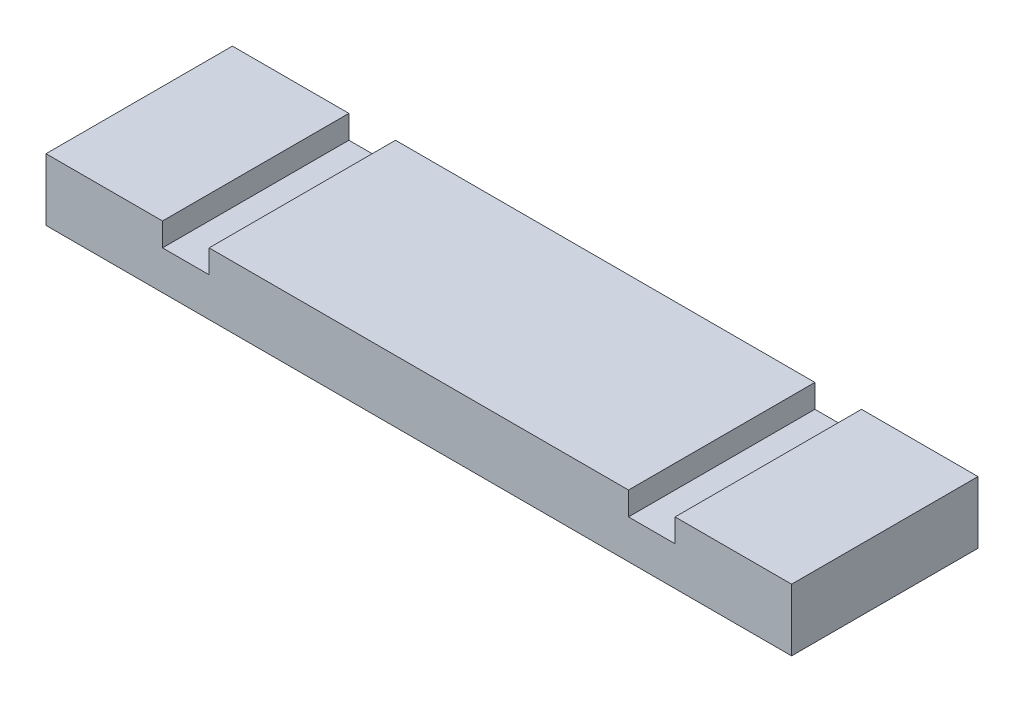
ISO-10303-21;
HEADER;
FILE_DESCRIPTION(('STEP AP214'),'2;1');
FILE_NAME('part.step','',(''),(''),'','','');
FILE_SCHEMA(('AUTOMOTIVE_DESIGN { 1 0 10303 214 1 1 1 1 }'));
ENDSEC;
DATA;
#1=APPLICATION_CONTEXT('core data for automotive mechanical design processes');
#2=APPLICATION_PROTOCOL_DEFINITION('international standard','automotive_design',2000,#1);
#3=PRODUCT_CONTEXT('',#1,'mechanical');
#4=PRODUCT('Part','Part','',(#3));
#5=PRODUCT_RELATED_PRODUCT_CATEGORY('part','',(#4));
#6=PRODUCT_DEFINITION_FORMATION('','',#4);
#7=PRODUCT_DEFINITION_CONTEXT('part definition',#1,'design');
#8=PRODUCT_DEFINITION('design','',#6,#7);
#9=PRODUCT_DEFINITION_SHAPE('','',#8);
#10=(LENGTH_UNIT() NAMED_UNIT(*) SI_UNIT(.MILLI.,.METRE.));
#11=(NAMED_UNIT(*) PLANE_ANGLE_UNIT() SI_UNIT($,.RADIAN.));
#12=(NAMED_UNIT(*) SI_UNIT($,.STERADIAN.) SOLID_ANGLE_UNIT());
#13=UNCERTAINTY_MEASURE_WITH_UNIT(LENGTH_MEASURE(1.E-05),#10,'distance_accuracy_value','');
#14=(GEOMETRIC_REPRESENTATION_CONTEXT(3) GLOBAL_UNCERTAINTY_ASSIGNED_CONTEXT((#13)) GLOBAL_UNIT_ASSIGNED_CONTEXT((#10,
#11,#12)) REPRESENTATION_CONTEXT('',''));
#15=CARTESIAN_POINT('',(0.,0.,0.));
#16=DIRECTION('',(0.,0.,1.));
#17=DIRECTION('',(1.,0.,0.));
#18=AXIS2_PLACEMENT_3D('',#15,#16,#17);
#19=CARTESIAN_POINT('',(0.,4.,0.));
#20=DIRECTION('',(0.,-1.,0.));
#21=DIRECTION('',(0.,0.,-1.));
#22=AXIS2_PLACEMENT_3D('',#19,#20,#21);
#23=PLANE('',#22);
#24=DIRECTION('',(0.,0.,1.));
#25=VECTOR('',#24,1.);
#26=CARTESIAN_POINT('',(-16.5,4.,-6.));
#27=LINE('',#26,#25);
#28=CARTESIAN_POINT('',(-16.5,4.,-6.));
#29=VERTEX_POINT('',#28);
#30=CARTESIAN_POINT('',(-16.5,4.,6.));
#31=VERTEX_POINT('',#30);
#32=EDGE_CURVE('E173',#29,#31,#27,.T.);
#33=ORIENTED_EDGE('',*,*,#32,.F.);
#34=DIRECTION('',(-1.,0.,0.));
#35=VECTOR('',#34,1.);
#36=CARTESIAN_POINT('',(-24.,4.,-6.));
#37=LINE('',#36,#35);
#38=CARTESIAN_POINT('',(-24.,4.,-6.));
#39=VERTEX_POINT('',#38);
#40=EDGE_CURVE('E185',#29,#39,#37,.T.);
#41=ORIENTED_EDGE('',*,*,#40,.T.);
#42=DIRECTION('',(0.,0.,1.));
#43=VECTOR('',#42,1.);
#44=CARTESIAN_POINT('',(-24.,4.,6.));
#45=LINE('',#44,#43);
#46=CARTESIAN_POINT('',(-24.,4.,6.));
#47=VERTEX_POINT('',#46);
#48=EDGE_CURVE('E190',#39,#47,#45,.T.);
#49=ORIENTED_EDGE('',*,*,#48,.T.);
#50=DIRECTION('',(1.,0.,0.));
#51=VECTOR('',#50,1.);
#52=CARTESIAN_POINT('',(-24.,4.,6.));
#53=LINE('',#52,#51);
#54=EDGE_CURVE('E192',#47,#31,#53,.T.);
#55=ORIENTED_EDGE('',*,*,#54,.T.);
#56=EDGE_LOOP('',(#33,#41,#49,#55));
#57=FACE_BOUND('',#56,.T.);
#58=ADVANCED_FACE('F39',(#57),#23,.F.);
#59=DIRECTION('',(0.,0.,-1.));
#60=VECTOR('',#59,1.);
#61=CARTESIAN_POINT('',(-13.5,4.,-6.));
#62=LINE('',#61,#60);
#63=CARTESIAN_POINT('',(-13.5,4.,6.));
#64=VERTEX_POINT('',#63);
#65=CARTESIAN_POINT('',(-13.5,4.,-6.));
#66=VERTEX_POINT('',#65);
#67=EDGE_CURVE('E234',#64,#66,#62,.T.);
#68=ORIENTED_EDGE('',*,*,#67,.F.);
#69=CARTESIAN_POINT('',(13.5,4.,6.));
#70=VERTEX_POINT('',#69);
#71=EDGE_CURVE('E146',#64,#70,#53,.T.);
#72=ORIENTED_EDGE('',*,*,#71,.T.);
#73=DIRECTION('',(0.,0.,1.));
#74=VECTOR('',#73,1.);
#75=CARTESIAN_POINT('',(13.5,4.,-6.));
#76=LINE('',#75,#74);
#77=CARTESIAN_POINT('',(13.5,4.,-6.));
#78=VERTEX_POINT('',#77);
#79=EDGE_CURVE('E170',#78,#70,#76,.T.);
#80=ORIENTED_EDGE('',*,*,#79,.F.);
#81=EDGE_CURVE('E187',#78,#66,#37,.T.);
#82=ORIENTED_EDGE('',*,*,#81,.T.);
#83=EDGE_LOOP('',(#68,#72,#80,#82));
#84=FACE_BOUND('',#83,.T.);
#85=ADVANCED_FACE('F235',(#84),#23,.F.);
#86=DIRECTION('',(0.,0.,-1.));
#87=VECTOR('',#86,1.);
#88=CARTESIAN_POINT('',(16.5,4.,-6.));
#89=LINE('',#88,#87);
#90=CARTESIAN_POINT('',(16.5,4.,6.));
#91=VERTEX_POINT('',#90);
#92=CARTESIAN_POINT('',(16.5,4.,-6.));
#93=VERTEX_POINT('',#92);
#94=EDGE_CURVE('E167',#91,#93,#89,.T.);
#95=ORIENTED_EDGE('',*,*,#94,.F.);
#96=CARTESIAN_POINT('',(24.,4.,6.));
#97=VERTEX_POINT('',#96);
#98=EDGE_CURVE('E189',#91,#97,#53,.T.);
#99=ORIENTED_EDGE('',*,*,#98,.T.);
#100=DIRECTION('',(0.,0.,-1.));
#101=VECTOR('',#100,1.);
#102=CARTESIAN_POINT('',(24.,4.,6.));
#103=LINE('',#102,#101);
#104=CARTESIAN_POINT('',(24.,4.,-6.));
#105=VERTEX_POINT('',#104);
#106=EDGE_CURVE('E177',#97,#105,#103,.T.);
#107=ORIENTED_EDGE('',*,*,#106,.T.);
#108=EDGE_CURVE('E182',#105,#93,#37,.T.);
#109=ORIENTED_EDGE('',*,*,#108,.T.);
#110=EDGE_LOOP('',(#95,#99,#107,#109));
#111=FACE_BOUND('',#110,.T.);
#112=ADVANCED_FACE('F228',(#111),#23,.F.);
#113=CARTESIAN_POINT('',(24.,4.,6.));
#114=DIRECTION('',(-1.,0.,0.));
#115=DIRECTION('',(0.,0.,1.));
#116=AXIS2_PLACEMENT_3D('',#113,#114,#115);
#117=PLANE('',#116);
#118=DIRECTION('',(0.,0.,-1.));
#119=VECTOR('',#118,1.);
#120=CARTESIAN_POINT('',(24.,0.,6.));
#121=LINE('',#120,#119);
#122=CARTESIAN_POINT('',(24.,0.,6.));
#123=VERTEX_POINT('',#122);
#124=CARTESIAN_POINT('',(24.,0.,-6.));
#125=VERTEX_POINT('',#124);
#126=EDGE_CURVE('E193',#123,#125,#121,.T.);
#127=ORIENTED_EDGE('',*,*,#126,.T.);
#128=DIRECTION('',(0.,-1.,0.));
#129=VECTOR('',#128,1.);
#130=CARTESIAN_POINT('',(24.,4.,-6.));
#131=LINE('',#130,#129);
#132=EDGE_CURVE('E11',#105,#125,#131,.T.);
#133=ORIENTED_EDGE('',*,*,#132,.F.);
#134=ORIENTED_EDGE('',*,*,#106,.F.);
#135=DIRECTION('',(0.,-1.,0.));
#136=VECTOR('',#135,1.);
#137=CARTESIAN_POINT('',(24.,4.,6.));
#138=LINE('',#137,#136);
#139=EDGE_CURVE('E191',#97,#123,#138,.T.);
#140=ORIENTED_EDGE('',*,*,#139,.T.);
#141=EDGE_LOOP('',(#127,#133,#134,#140));
#142=FACE_BOUND('',#141,.T.);
#143=ADVANCED_FACE('F41',(#142),#117,.F.);
#144=CARTESIAN_POINT('',(-24.,4.,-6.));
#145=DIRECTION('',(0.,0.,1.));
#146=DIRECTION('',(1.,0.,0.));
#147=AXIS2_PLACEMENT_3D('',#144,#145,#146);
#148=PLANE('',#147);
#149=DIRECTION('',(-1.,0.,0.));
#150=VECTOR('',#149,1.);
#151=CARTESIAN_POINT('',(-16.5,2.5,-6.));
#152=LINE('',#151,#150);
#153=CARTESIAN_POINT('',(-13.5,2.5,-6.));
#154=VERTEX_POINT('',#153);
#155=CARTESIAN_POINT('',(-16.5,2.5,-6.));
#156=VERTEX_POINT('',#155);
#157=EDGE_CURVE('E140',#154,#156,#152,.T.);
#158=ORIENTED_EDGE('',*,*,#157,.F.);
#159=DIRECTION('',(0.,1.,0.));
#160=VECTOR('',#159,1.);
#161=CARTESIAN_POINT('',(-13.5,2.5,-6.));
#162=LINE('',#161,#160);
#163=EDGE_CURVE('E134',#154,#66,#162,.T.);
#164=ORIENTED_EDGE('',*,*,#163,.T.);
#165=ORIENTED_EDGE('',*,*,#81,.F.);
#166=DIRECTION('',(0.,1.,0.));
#167=VECTOR('',#166,1.);
#168=CARTESIAN_POINT('',(13.5,2.5,-6.));
#169=LINE('',#168,#167);
#170=CARTESIAN_POINT('',(13.5,2.5,-6.));
#171=VERTEX_POINT('',#170);
#172=EDGE_CURVE('E161',#171,#78,#169,.T.);
#173=ORIENTED_EDGE('',*,*,#172,.F.);
#174=DIRECTION('',(-1.,0.,0.));
#175=VECTOR('',#174,1.);
#176=CARTESIAN_POINT('',(13.5,2.5,-6.));
#177=LINE('',#176,#175);
#178=CARTESIAN_POINT('',(16.5,2.5,-6.));
#179=VERTEX_POINT('',#178);
#180=EDGE_CURVE('E159',#179,#171,#177,.T.);
#181=ORIENTED_EDGE('',*,*,#180,.F.);
#182=DIRECTION('',(0.,1.,0.));
#183=VECTOR('',#182,1.);
#184=CARTESIAN_POINT('',(16.5,2.5,-6.));
#185=LINE('',#184,#183);
#186=EDGE_CURVE('E165',#179,#93,#185,.T.);
#187=ORIENTED_EDGE('',*,*,#186,.T.);
#188=ORIENTED_EDGE('',*,*,#108,.F.);
#189=ORIENTED_EDGE('',*,*,#132,.T.);
#190=DIRECTION('',(-1.,0.,0.));
#191=VECTOR('',#190,1.);
#192=CARTESIAN_POINT('',(-24.,0.,-6.));
#193=LINE('',#192,#191);
#194=CARTESIAN_POINT('',(-24.,0.,-6.));
#195=VERTEX_POINT('',#194);
#196=EDGE_CURVE('E198',#125,#195,#193,.T.);
#197=ORIENTED_EDGE('',*,*,#196,.T.);
#198=DIRECTION('',(0.,-1.,0.));
#199=VECTOR('',#198,1.);
#200=CARTESIAN_POINT('',(-24.,4.,-6.));
#201=LINE('',#200,#199);
#202=EDGE_CURVE('E50',#39,#195,#201,.T.);
#203=ORIENTED_EDGE('',*,*,#202,.F.);
#204=ORIENTED_EDGE('',*,*,#40,.F.);
#205=DIRECTION('',(0.,1.,0.));
#206=VECTOR('',#205,1.);
#207=CARTESIAN_POINT('',(-16.5,2.5,-6.));
#208=LINE('',#207,#206);
#209=EDGE_CURVE('E155',#156,#29,#208,.T.);
#210=ORIENTED_EDGE('',*,*,#209,.F.);
#211=EDGE_LOOP('',(#158,#164,#165,#173,#181,#187,#188,#189,#197,#203,#204,#210));
#212=FACE_BOUND('',#211,.T.);
#213=ADVANCED_FACE('F241',(#212),#148,.F.);
#214=CARTESIAN_POINT('',(-24.,4.,6.));
#215=DIRECTION('',(1.,0.,0.));
#216=DIRECTION('',(0.,0.,-1.));
#217=AXIS2_PLACEMENT_3D('',#214,#215,#216);
#218=PLANE('',#217);
#219=DIRECTION('',(0.,0.,1.));
#220=VECTOR('',#219,1.);
#221=CARTESIAN_POINT('',(-24.,0.,6.));
#222=LINE('',#221,#220);
#223=CARTESIAN_POINT('',(-24.,0.,6.));
#224=VERTEX_POINT('',#223);
#225=EDGE_CURVE('E196',#195,#224,#222,.T.);
#226=ORIENTED_EDGE('',*,*,#225,.T.);
#227=DIRECTION('',(0.,-1.,0.));
#228=VECTOR('',#227,1.);
#229=CARTESIAN_POINT('',(-24.,4.,6.));
#230=LINE('',#229,#228);
#231=EDGE_CURVE('E203',#47,#224,#230,.T.);
#232=ORIENTED_EDGE('',*,*,#231,.F.);
#233=ORIENTED_EDGE('',*,*,#48,.F.);
#234=ORIENTED_EDGE('',*,*,#202,.T.);
#235=EDGE_LOOP('',(#226,#232,#233,#234));
#236=FACE_BOUND('',#235,.T.);
#237=ADVANCED_FACE('F212',(#236),#218,.F.);
#238=CARTESIAN_POINT('',(-24.,4.,6.));
#239=DIRECTION('',(0.,0.,-1.));
#240=DIRECTION('',(-1.,0.,0.));
#241=AXIS2_PLACEMENT_3D('',#238,#239,#240);
#242=PLANE('',#241);
#243=DIRECTION('',(1.,0.,0.));
#244=VECTOR('',#243,1.);
#245=CARTESIAN_POINT('',(-16.5,2.5,6.));
#246=LINE('',#245,#244);
#247=CARTESIAN_POINT('',(-16.5,2.5,6.));
#248=VERTEX_POINT('',#247);
#249=CARTESIAN_POINT('',(-13.5,2.5,6.));
#250=VERTEX_POINT('',#249);
#251=EDGE_CURVE('E138',#248,#250,#246,.T.);
#252=ORIENTED_EDGE('',*,*,#251,.F.);
#253=DIRECTION('',(0.,1.,0.));
#254=VECTOR('',#253,1.);
#255=CARTESIAN_POINT('',(-16.5,2.5,6.));
#256=LINE('',#255,#254);
#257=EDGE_CURVE('E148',#248,#31,#256,.T.);
#258=ORIENTED_EDGE('',*,*,#257,.T.);
#259=ORIENTED_EDGE('',*,*,#54,.F.);
#260=ORIENTED_EDGE('',*,*,#231,.T.);
#261=DIRECTION('',(1.,0.,0.));
#262=VECTOR('',#261,1.);
#263=CARTESIAN_POINT('',(-24.,0.,6.));
#264=LINE('',#263,#262);
#265=EDGE_CURVE('E183',#224,#123,#264,.T.);
#266=ORIENTED_EDGE('',*,*,#265,.T.);
#267=ORIENTED_EDGE('',*,*,#139,.F.);
#268=ORIENTED_EDGE('',*,*,#98,.F.);
#269=DIRECTION('',(0.,1.,0.));
#270=VECTOR('',#269,1.);
#271=CARTESIAN_POINT('',(16.5,2.5,6.));
#272=LINE('',#271,#270);
#273=CARTESIAN_POINT('',(16.5,2.5,6.));
#274=VERTEX_POINT('',#273);
#275=EDGE_CURVE('E158',#274,#91,#272,.T.);
#276=ORIENTED_EDGE('',*,*,#275,.F.);
#277=DIRECTION('',(1.,0.,0.));
#278=VECTOR('',#277,1.);
#279=CARTESIAN_POINT('',(13.5,2.5,6.));
#280=LINE('',#279,#278);
#281=CARTESIAN_POINT('',(13.5,2.5,6.));
#282=VERTEX_POINT('',#281);
#283=EDGE_CURVE('E176',#282,#274,#280,.T.);
#284=ORIENTED_EDGE('',*,*,#283,.F.);
#285=DIRECTION('',(0.,1.,0.));
#286=VECTOR('',#285,1.);
#287=CARTESIAN_POINT('',(13.5,2.5,6.));
#288=LINE('',#287,#286);
#289=EDGE_CURVE('E160',#282,#70,#288,.T.);
#290=ORIENTED_EDGE('',*,*,#289,.T.);
#291=ORIENTED_EDGE('',*,*,#71,.F.);
#292=DIRECTION('',(0.,1.,0.));
#293=VECTOR('',#292,1.);
#294=CARTESIAN_POINT('',(-13.5,2.5,6.));
#295=LINE('',#294,#293);
#296=EDGE_CURVE('E135',#250,#64,#295,.T.);
#297=ORIENTED_EDGE('',*,*,#296,.F.);
#298=EDGE_LOOP('',(#252,#258,#259,#260,#266,#267,#268,#276,#284,#290,#291,#297));
#299=FACE_BOUND('',#298,.T.);
#300=ADVANCED_FACE('F147',(#299),#242,.F.);
#301=CARTESIAN_POINT('',(0.,0.,0.));
#302=DIRECTION('',(0.,-1.,0.));
#303=DIRECTION('',(0.,0.,-1.));
#304=AXIS2_PLACEMENT_3D('',#301,#302,#303);
#305=PLANE('',#304);
#306=ORIENTED_EDGE('',*,*,#126,.F.);
#307=ORIENTED_EDGE('',*,*,#265,.F.);
#308=ORIENTED_EDGE('',*,*,#225,.F.);
#309=ORIENTED_EDGE('',*,*,#196,.F.);
#310=EDGE_LOOP('',(#306,#307,#308,#309));
#311=FACE_BOUND('',#310,.T.);
#312=ADVANCED_FACE('F219',(#311),#305,.T.);
#313=CARTESIAN_POINT('',(13.5,2.5,-6.));
#314=DIRECTION('',(-1.,0.,0.));
#315=DIRECTION('',(0.,0.,1.));
#316=AXIS2_PLACEMENT_3D('',#313,#314,#315);
#317=PLANE('',#316);
#318=ORIENTED_EDGE('',*,*,#79,.T.);
#319=ORIENTED_EDGE('',*,*,#289,.F.);
#320=DIRECTION('',(0.,0.,1.));
#321=VECTOR('',#320,1.);
#322=CARTESIAN_POINT('',(13.5,2.5,-6.));
#323=LINE('',#322,#321);
#324=EDGE_CURVE('E65',#171,#282,#323,.T.);
#325=ORIENTED_EDGE('',*,*,#324,.F.);
#326=ORIENTED_EDGE('',*,*,#172,.T.);
#327=EDGE_LOOP('',(#318,#319,#325,#326));
#328=FACE_BOUND('',#327,.T.);
#329=ADVANCED_FACE('F285',(#328),#317,.F.);
#330=CARTESIAN_POINT('',(16.5,2.5,-6.));
#331=DIRECTION('',(1.,0.,0.));
#332=DIRECTION('',(0.,0.,-1.));
#333=AXIS2_PLACEMENT_3D('',#330,#331,#332);
#334=PLANE('',#333);
#335=ORIENTED_EDGE('',*,*,#94,.T.);
#336=ORIENTED_EDGE('',*,*,#186,.F.);
#337=DIRECTION('',(0.,0.,-1.));
#338=VECTOR('',#337,1.);
#339=CARTESIAN_POINT('',(16.5,2.5,-6.));
#340=LINE('',#339,#338);
#341=EDGE_CURVE('E171',#274,#179,#340,.T.);
#342=ORIENTED_EDGE('',*,*,#341,.F.);
#343=ORIENTED_EDGE('',*,*,#275,.T.);
#344=EDGE_LOOP('',(#335,#336,#342,#343));
#345=FACE_BOUND('',#344,.T.);
#346=ADVANCED_FACE('F290',(#345),#334,.F.);
#347=CARTESIAN_POINT('',(0.,2.5,0.));
#348=DIRECTION('',(0.,1.,0.));
#349=DIRECTION('',(0.,0.,1.));
#350=AXIS2_PLACEMENT_3D('',#347,#348,#349);
#351=PLANE('',#350);
#352=ORIENTED_EDGE('',*,*,#324,.T.);
#353=ORIENTED_EDGE('',*,*,#283,.T.);
#354=ORIENTED_EDGE('',*,*,#341,.T.);
#355=ORIENTED_EDGE('',*,*,#180,.T.);
#356=EDGE_LOOP('',(#352,#353,#354,#355));
#357=FACE_BOUND('',#356,.T.);
#358=ADVANCED_FACE('F300',(#357),#351,.T.);
#359=CARTESIAN_POINT('',(-16.5,2.5,-6.));
#360=DIRECTION('',(-1.,0.,0.));
#361=DIRECTION('',(0.,0.,1.));
#362=AXIS2_PLACEMENT_3D('',#359,#360,#361);
#363=PLANE('',#362);
#364=ORIENTED_EDGE('',*,*,#32,.T.);
#365=ORIENTED_EDGE('',*,*,#257,.F.);
#366=DIRECTION('',(0.,0.,1.));
#367=VECTOR('',#366,1.);
#368=CARTESIAN_POINT('',(-16.5,2.5,-6.));
#369=LINE('',#368,#367);
#370=EDGE_CURVE('E53',#156,#248,#369,.T.);
#371=ORIENTED_EDGE('',*,*,#370,.F.);
#372=ORIENTED_EDGE('',*,*,#209,.T.);
#373=EDGE_LOOP('',(#364,#365,#371,#372));
#374=FACE_BOUND('',#373,.T.);
#375=ADVANCED_FACE('F243',(#374),#363,.F.);
#376=CARTESIAN_POINT('',(-13.5,2.5,-6.));
#377=DIRECTION('',(1.,0.,0.));
#378=DIRECTION('',(0.,0.,-1.));
#379=AXIS2_PLACEMENT_3D('',#376,#377,#378);
#380=PLANE('',#379);
#381=ORIENTED_EDGE('',*,*,#67,.T.);
#382=ORIENTED_EDGE('',*,*,#163,.F.);
#383=DIRECTION('',(0.,0.,-1.));
#384=VECTOR('',#383,1.);
#385=CARTESIAN_POINT('',(-13.5,2.5,-6.));
#386=LINE('',#385,#384);
#387=EDGE_CURVE('E129',#250,#154,#386,.T.);
#388=ORIENTED_EDGE('',*,*,#387,.F.);
#389=ORIENTED_EDGE('',*,*,#296,.T.);
#390=EDGE_LOOP('',(#381,#382,#388,#389));
#391=FACE_BOUND('',#390,.T.);
#392=ADVANCED_FACE('F127',(#391),#380,.F.);
#393=CARTESIAN_POINT('',(0.,2.5,0.));
#394=DIRECTION('',(0.,1.,0.));
#395=DIRECTION('',(0.,0.,1.));
#396=AXIS2_PLACEMENT_3D('',#393,#394,#395);
#397=PLANE('',#396);
#398=ORIENTED_EDGE('',*,*,#370,.T.);
#399=ORIENTED_EDGE('',*,*,#251,.T.);
#400=ORIENTED_EDGE('',*,*,#387,.T.);
#401=ORIENTED_EDGE('',*,*,#157,.T.);
#402=EDGE_LOOP('',(#398,#399,#400,#401));
#403=FACE_BOUND('',#402,.T.);
#404=ADVANCED_FACE('F141',(#403),#397,.T.);
#405=CLOSED_SHELL('',(#58,#85,#112,#143,#213,#237,#300,#312,#329,#346,#358,#375,#392,#404));
#406=MANIFOLD_SOLID_BREP('B2',#405);
#407=ADVANCED_BREP_SHAPE_REPRESENTATION('',(#18,#406),#14);
#408=SHAPE_DEFINITION_REPRESENTATION(#9,#407);
ENDSEC;
END-ISO-10303-21;
